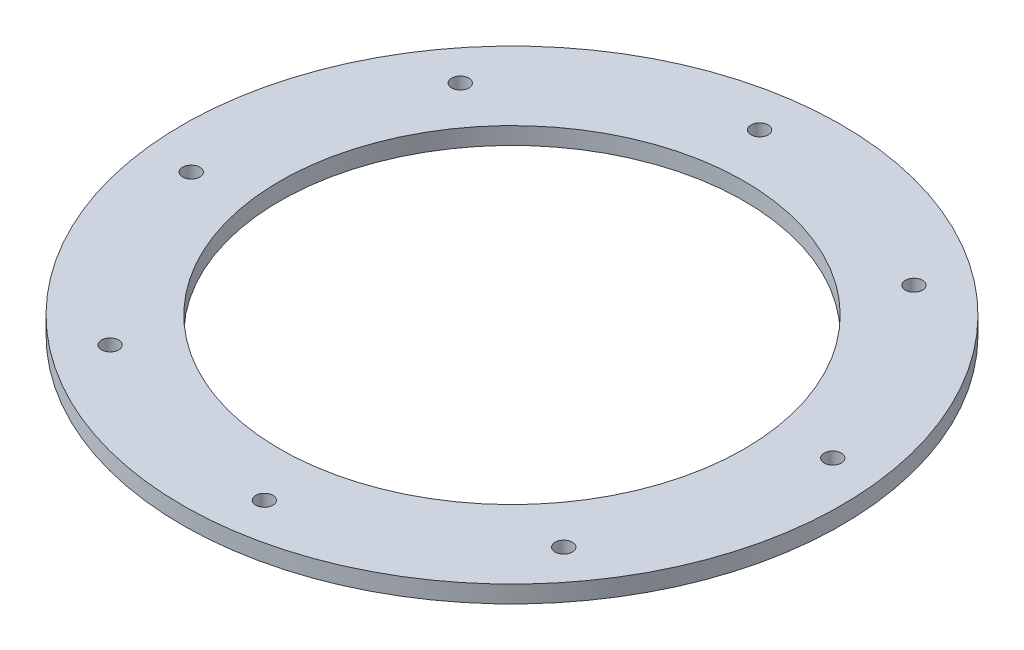
ISO-10303-21;
HEADER;
FILE_DESCRIPTION(('STEP AP214'),'2;1');
FILE_NAME('part.step','',(''),(''),'','','');
FILE_SCHEMA(('AUTOMOTIVE_DESIGN { 1 0 10303 214 1 1 1 1 }'));
ENDSEC;
DATA;
#1=APPLICATION_CONTEXT('core data for automotive mechanical design processes');
#2=APPLICATION_PROTOCOL_DEFINITION('international standard','automotive_design',2000,#1);
#3=PRODUCT_CONTEXT('',#1,'mechanical');
#4=PRODUCT('Part','Part','',(#3));
#5=PRODUCT_RELATED_PRODUCT_CATEGORY('part','',(#4));
#6=PRODUCT_DEFINITION_FORMATION('','',#4);
#7=PRODUCT_DEFINITION_CONTEXT('part definition',#1,'design');
#8=PRODUCT_DEFINITION('design','',#6,#7);
#9=PRODUCT_DEFINITION_SHAPE('','',#8);
#10=(LENGTH_UNIT() NAMED_UNIT(*) SI_UNIT(.MILLI.,.METRE.));
#11=(NAMED_UNIT(*) PLANE_ANGLE_UNIT() SI_UNIT($,.RADIAN.));
#12=(NAMED_UNIT(*) SI_UNIT($,.STERADIAN.) SOLID_ANGLE_UNIT());
#13=UNCERTAINTY_MEASURE_WITH_UNIT(LENGTH_MEASURE(1.E-05),#10,'distance_accuracy_value','');
#14=(GEOMETRIC_REPRESENTATION_CONTEXT(3) GLOBAL_UNCERTAINTY_ASSIGNED_CONTEXT((#13)) GLOBAL_UNIT_ASSIGNED_CONTEXT((#10,
#11,#12)) REPRESENTATION_CONTEXT('',''));
#15=CARTESIAN_POINT('',(0.,0.,0.));
#16=DIRECTION('',(0.,0.,1.));
#17=DIRECTION('',(1.,0.,0.));
#18=AXIS2_PLACEMENT_3D('',#15,#16,#17);
#19=CARTESIAN_POINT('',(0.,-11.,0.));
#20=DIRECTION('',(0.,-1.,0.));
#21=DIRECTION('',(0.791573236897793,0.,0.611074308596877));
#22=AXIS2_PLACEMENT_3D('',#19,#20,#21);
#23=CYLINDRICAL_SURFACE('',#22,40.5);
#24=CARTESIAN_POINT('',(0.,-11.,0.));
#25=DIRECTION('',(0.,1.,0.));
#26=DIRECTION('',(-0.791573236897793,0.,-0.611074308596877));
#27=AXIS2_PLACEMENT_3D('',#24,#25,#26);
#28=CIRCLE('',#27,40.5);
#29=CARTESIAN_POINT('',(-24.7485094981735,-11.,32.0587160943606));
#30=VERTEX_POINT('',#29);
#31=EDGE_CURVE('E11',#30,#30,#28,.T.);
#32=ORIENTED_EDGE('',*,*,#31,.T.);
#33=EDGE_LOOP('',(#32));
#34=FACE_BOUND('',#33,.T.);
#35=CARTESIAN_POINT('',(0.,-14.,0.));
#36=DIRECTION('',(0.,1.,0.));
#37=DIRECTION('',(-0.791573236897793,0.,-0.611074308596877));
#38=AXIS2_PLACEMENT_3D('',#35,#36,#37);
#39=CIRCLE('',#38,40.5);
#40=CARTESIAN_POINT('',(-24.7485094981735,-14.,32.0587160943606));
#41=VERTEX_POINT('',#40);
#42=EDGE_CURVE('E47',#41,#41,#39,.T.);
#43=ORIENTED_EDGE('',*,*,#42,.F.);
#44=EDGE_LOOP('',(#43));
#45=FACE_BOUND('',#44,.T.);
#46=ADVANCED_FACE('F44',(#34,#45),#23,.F.);
#47=CARTESIAN_POINT('',(0.,-11.,0.));
#48=DIRECTION('',(0.,-1.,0.));
#49=DIRECTION('',(0.791573236897793,0.,0.611074308596877));
#50=AXIS2_PLACEMENT_3D('',#47,#48,#49);
#51=CYLINDRICAL_SURFACE('',#50,57.5);
#52=CARTESIAN_POINT('',(0.,-11.,0.));
#53=DIRECTION('',(0.,1.,0.));
#54=DIRECTION('',(-0.611074308596877,0.,0.791573236897793));
#55=AXIS2_PLACEMENT_3D('',#52,#53,#54);
#56=CIRCLE('',#55,57.5);
#57=CARTESIAN_POINT('',(-35.1367727443204,-11.,45.5154611216231));
#58=VERTEX_POINT('',#57);
#59=EDGE_CURVE('E66',#58,#58,#56,.T.);
#60=ORIENTED_EDGE('',*,*,#59,.F.);
#61=EDGE_LOOP('',(#60));
#62=FACE_BOUND('',#61,.T.);
#63=CARTESIAN_POINT('',(0.,-14.,0.));
#64=DIRECTION('',(0.,1.,0.));
#65=DIRECTION('',(-0.611074308596877,0.,0.791573236897793));
#66=AXIS2_PLACEMENT_3D('',#63,#64,#65);
#67=CIRCLE('',#66,57.5);
#68=CARTESIAN_POINT('',(-35.1367727443204,-14.,45.5154611216231));
#69=VERTEX_POINT('',#68);
#70=EDGE_CURVE('E54',#69,#69,#67,.T.);
#71=ORIENTED_EDGE('',*,*,#70,.T.);
#72=EDGE_LOOP('',(#71));
#73=FACE_BOUND('',#72,.T.);
#74=ADVANCED_FACE('F67',(#62,#73),#51,.T.);
#75=CARTESIAN_POINT('',(0.,-11.,0.));
#76=DIRECTION('',(0.,1.,0.));
#77=DIRECTION('',(-0.611074308596877,0.,0.791573236897793));
#78=AXIS2_PLACEMENT_3D('',#75,#76,#77);
#79=PLANE('',#78);
#80=CARTESIAN_POINT('',(39.5786618448896,-11.,30.5537154298439));
#81=DIRECTION('',(0.,1.,0.));
#82=DIRECTION('',(-0.791573236897793,0.,-0.611074308596877));
#83=AXIS2_PLACEMENT_3D('',#80,#81,#82);
#84=CIRCLE('',#83,1.5);
#85=CARTESIAN_POINT('',(38.391301989543,-11.,29.6371039669485));
#86=VERTEX_POINT('',#85);
#87=EDGE_CURVE('E124',#86,#86,#84,.T.);
#88=ORIENTED_EDGE('',*,*,#87,.F.);
#89=EDGE_LOOP('',(#88));
#90=FACE_BOUND('',#89,.T.);
#91=CARTESIAN_POINT('',(6.38160080992409,-11.,49.5910795516974));
#92=DIRECTION('',(0.,1.,0.));
#93=DIRECTION('',(-0.791573236897793,0.,-0.611074308596877));
#94=AXIS2_PLACEMENT_3D('',#91,#92,#93);
#95=CIRCLE('',#94,1.50000000000001);
#96=CARTESIAN_POINT('',(5.1942409545774,-11.,48.674468088802));
#97=VERTEX_POINT('',#96);
#98=EDGE_CURVE('E118',#97,#97,#95,.T.);
#99=ORIENTED_EDGE('',*,*,#98,.F.);
#100=EDGE_LOOP('',(#99));
#101=FACE_BOUND('',#100,.T.);
#102=CARTESIAN_POINT('',(-30.5537154298439,-11.,39.5786618448896));
#103=DIRECTION('',(0.,1.,0.));
#104=DIRECTION('',(-0.791573236897793,0.,-0.611074308596877));
#105=AXIS2_PLACEMENT_3D('',#102,#103,#104);
#106=CIRCLE('',#105,1.5);
#107=CARTESIAN_POINT('',(-31.7410752851905,-11.,38.6620503819943));
#108=VERTEX_POINT('',#107);
#109=EDGE_CURVE('E112',#108,#108,#106,.T.);
#110=ORIENTED_EDGE('',*,*,#109,.F.);
#111=EDGE_LOOP('',(#110));
#112=FACE_BOUND('',#111,.T.);
#113=CARTESIAN_POINT('',(-49.5910795516974,-11.,6.3816008099241));
#114=DIRECTION('',(0.,1.,0.));
#115=DIRECTION('',(-0.791573236897793,0.,-0.611074308596877));
#116=AXIS2_PLACEMENT_3D('',#113,#114,#115);
#117=CIRCLE('',#116,1.5);
#118=CARTESIAN_POINT('',(-50.7784394070441,-11.,5.46498934702878));
#119=VERTEX_POINT('',#118);
#120=EDGE_CURVE('E106',#119,#119,#117,.T.);
#121=ORIENTED_EDGE('',*,*,#120,.F.);
#122=EDGE_LOOP('',(#121));
#123=FACE_BOUND('',#122,.T.);
#124=CARTESIAN_POINT('',(-39.5786618448896,-11.,-30.5537154298438));
#125=DIRECTION('',(0.,1.,0.));
#126=DIRECTION('',(-0.791573236897793,0.,-0.611074308596877));
#127=AXIS2_PLACEMENT_3D('',#124,#125,#126);
#128=CIRCLE('',#127,1.5);
#129=CARTESIAN_POINT('',(-40.7660217002363,-11.,-31.4703268927392));
#130=VERTEX_POINT('',#129);
#131=EDGE_CURVE('E100',#130,#130,#128,.T.);
#132=ORIENTED_EDGE('',*,*,#131,.F.);
#133=EDGE_LOOP('',(#132));
#134=FACE_BOUND('',#133,.T.);
#135=CARTESIAN_POINT('',(-6.3816008099241,-11.,-49.5910795516974));
#136=DIRECTION('',(0.,1.,0.));
#137=DIRECTION('',(-0.791573236897793,0.,-0.611074308596877));
#138=AXIS2_PLACEMENT_3D('',#135,#136,#137);
#139=CIRCLE('',#138,1.5);
#140=CARTESIAN_POINT('',(-7.56896066527079,-11.,-50.5076910145927));
#141=VERTEX_POINT('',#140);
#142=EDGE_CURVE('E94',#141,#141,#139,.T.);
#143=ORIENTED_EDGE('',*,*,#142,.F.);
#144=EDGE_LOOP('',(#143));
#145=FACE_BOUND('',#144,.T.);
#146=CARTESIAN_POINT('',(30.5537154298438,-11.,-39.5786618448896));
#147=DIRECTION('',(0.,1.,0.));
#148=DIRECTION('',(-0.791573236897793,0.,-0.611074308596877));
#149=AXIS2_PLACEMENT_3D('',#146,#147,#148);
#150=CIRCLE('',#149,1.5);
#151=CARTESIAN_POINT('',(29.3663555744972,-11.,-40.495273307785));
#152=VERTEX_POINT('',#151);
#153=EDGE_CURVE('E86',#152,#152,#150,.T.);
#154=ORIENTED_EDGE('',*,*,#153,.F.);
#155=EDGE_LOOP('',(#154));
#156=FACE_BOUND('',#155,.T.);
#157=CARTESIAN_POINT('',(49.5910795516974,-11.,-6.3816008099241));
#158=DIRECTION('',(0.,1.,0.));
#159=DIRECTION('',(-0.791573236897793,0.,-0.611074308596877));
#160=AXIS2_PLACEMENT_3D('',#157,#158,#159);
#161=CIRCLE('',#160,1.5);
#162=CARTESIAN_POINT('',(48.4037196963507,-11.,-7.29821227281942));
#163=VERTEX_POINT('',#162);
#164=EDGE_CURVE('E80',#163,#163,#161,.T.);
#165=ORIENTED_EDGE('',*,*,#164,.F.);
#166=EDGE_LOOP('',(#165));
#167=FACE_BOUND('',#166,.T.);
#168=ORIENTED_EDGE('',*,*,#31,.F.);
#169=EDGE_LOOP('',(#168));
#170=FACE_BOUND('',#169,.T.);
#171=ORIENTED_EDGE('',*,*,#59,.T.);
#172=EDGE_LOOP('',(#171));
#173=FACE_BOUND('',#172,.T.);
#174=ADVANCED_FACE('F140',(#90,#101,#112,#123,#134,#145,#156,#167,#170,#173),#79,.T.);
#175=CARTESIAN_POINT('',(0.,-14.,0.));
#176=DIRECTION('',(0.,1.,0.));
#177=DIRECTION('',(-0.611074308596877,0.,0.791573236897793));
#178=AXIS2_PLACEMENT_3D('',#175,#176,#177);
#179=PLANE('',#178);
#180=CARTESIAN_POINT('',(39.5786618448896,-14.,30.5537154298439));
#181=DIRECTION('',(0.,1.,0.));
#182=DIRECTION('',(-0.791573236897793,0.,-0.611074308596877));
#183=AXIS2_PLACEMENT_3D('',#180,#181,#182);
#184=CIRCLE('',#183,1.5);
#185=CARTESIAN_POINT('',(38.391301989543,-14.,29.6371039669485));
#186=VERTEX_POINT('',#185);
#187=EDGE_CURVE('E78',#186,#186,#184,.T.);
#188=ORIENTED_EDGE('',*,*,#187,.T.);
#189=EDGE_LOOP('',(#188));
#190=FACE_BOUND('',#189,.T.);
#191=CARTESIAN_POINT('',(6.38160080992409,-14.,49.5910795516974));
#192=DIRECTION('',(0.,1.,0.));
#193=DIRECTION('',(-0.791573236897793,0.,-0.611074308596877));
#194=AXIS2_PLACEMENT_3D('',#191,#192,#193);
#195=CIRCLE('',#194,1.50000000000001);
#196=CARTESIAN_POINT('',(5.1942409545774,-14.,48.674468088802));
#197=VERTEX_POINT('',#196);
#198=EDGE_CURVE('E121',#197,#197,#195,.T.);
#199=ORIENTED_EDGE('',*,*,#198,.T.);
#200=EDGE_LOOP('',(#199));
#201=FACE_BOUND('',#200,.T.);
#202=CARTESIAN_POINT('',(-30.5537154298439,-14.,39.5786618448896));
#203=DIRECTION('',(0.,1.,0.));
#204=DIRECTION('',(-0.791573236897793,0.,-0.611074308596877));
#205=AXIS2_PLACEMENT_3D('',#202,#203,#204);
#206=CIRCLE('',#205,1.5);
#207=CARTESIAN_POINT('',(-31.7410752851905,-14.,38.6620503819943));
#208=VERTEX_POINT('',#207);
#209=EDGE_CURVE('E115',#208,#208,#206,.T.);
#210=ORIENTED_EDGE('',*,*,#209,.T.);
#211=EDGE_LOOP('',(#210));
#212=FACE_BOUND('',#211,.T.);
#213=CARTESIAN_POINT('',(-49.5910795516974,-14.,6.3816008099241));
#214=DIRECTION('',(0.,1.,0.));
#215=DIRECTION('',(-0.791573236897793,0.,-0.611074308596877));
#216=AXIS2_PLACEMENT_3D('',#213,#214,#215);
#217=CIRCLE('',#216,1.5);
#218=CARTESIAN_POINT('',(-50.7784394070441,-14.,5.46498934702878));
#219=VERTEX_POINT('',#218);
#220=EDGE_CURVE('E109',#219,#219,#217,.T.);
#221=ORIENTED_EDGE('',*,*,#220,.T.);
#222=EDGE_LOOP('',(#221));
#223=FACE_BOUND('',#222,.T.);
#224=CARTESIAN_POINT('',(-39.5786618448896,-14.,-30.5537154298438));
#225=DIRECTION('',(0.,1.,0.));
#226=DIRECTION('',(-0.791573236897793,0.,-0.611074308596877));
#227=AXIS2_PLACEMENT_3D('',#224,#225,#226);
#228=CIRCLE('',#227,1.5);
#229=CARTESIAN_POINT('',(-40.7660217002363,-14.,-31.4703268927392));
#230=VERTEX_POINT('',#229);
#231=EDGE_CURVE('E103',#230,#230,#228,.T.);
#232=ORIENTED_EDGE('',*,*,#231,.T.);
#233=EDGE_LOOP('',(#232));
#234=FACE_BOUND('',#233,.T.);
#235=CARTESIAN_POINT('',(-6.3816008099241,-14.,-49.5910795516974));
#236=DIRECTION('',(0.,1.,0.));
#237=DIRECTION('',(-0.791573236897793,0.,-0.611074308596877));
#238=AXIS2_PLACEMENT_3D('',#235,#236,#237);
#239=CIRCLE('',#238,1.5);
#240=CARTESIAN_POINT('',(-7.56896066527079,-14.,-50.5076910145927));
#241=VERTEX_POINT('',#240);
#242=EDGE_CURVE('E97',#241,#241,#239,.T.);
#243=ORIENTED_EDGE('',*,*,#242,.T.);
#244=EDGE_LOOP('',(#243));
#245=FACE_BOUND('',#244,.T.);
#246=CARTESIAN_POINT('',(30.5537154298438,-14.,-39.5786618448896));
#247=DIRECTION('',(0.,1.,0.));
#248=DIRECTION('',(-0.791573236897793,0.,-0.611074308596877));
#249=AXIS2_PLACEMENT_3D('',#246,#247,#248);
#250=CIRCLE('',#249,1.5);
#251=CARTESIAN_POINT('',(29.3663555744972,-14.,-40.495273307785));
#252=VERTEX_POINT('',#251);
#253=EDGE_CURVE('E90',#252,#252,#250,.T.);
#254=ORIENTED_EDGE('',*,*,#253,.T.);
#255=EDGE_LOOP('',(#254));
#256=FACE_BOUND('',#255,.T.);
#257=CARTESIAN_POINT('',(49.5910795516974,-14.,-6.3816008099241));
#258=DIRECTION('',(0.,1.,0.));
#259=DIRECTION('',(-0.791573236897793,0.,-0.611074308596877));
#260=AXIS2_PLACEMENT_3D('',#257,#258,#259);
#261=CIRCLE('',#260,1.5);
#262=CARTESIAN_POINT('',(48.4037196963507,-14.,-7.29821227281942));
#263=VERTEX_POINT('',#262);
#264=EDGE_CURVE('E83',#263,#263,#261,.T.);
#265=ORIENTED_EDGE('',*,*,#264,.T.);
#266=EDGE_LOOP('',(#265));
#267=FACE_BOUND('',#266,.T.);
#268=ORIENTED_EDGE('',*,*,#42,.T.);
#269=EDGE_LOOP('',(#268));
#270=FACE_BOUND('',#269,.T.);
#271=ORIENTED_EDGE('',*,*,#70,.F.);
#272=EDGE_LOOP('',(#271));
#273=FACE_BOUND('',#272,.T.);
#274=ADVANCED_FACE('F130',(#190,#201,#212,#223,#234,#245,#256,#267,#270,#273),#179,.F.);
#275=CARTESIAN_POINT('',(49.5910795516974,-14.,-6.3816008099241));
#276=DIRECTION('',(0.,1.,0.));
#277=DIRECTION('',(-0.791573236897793,0.,-0.611074308596877));
#278=AXIS2_PLACEMENT_3D('',#275,#276,#277);
#279=CYLINDRICAL_SURFACE('',#278,1.5);
#280=ORIENTED_EDGE('',*,*,#264,.F.);
#281=EDGE_LOOP('',(#280));
#282=FACE_BOUND('',#281,.T.);
#283=ORIENTED_EDGE('',*,*,#164,.T.);
#284=EDGE_LOOP('',(#283));
#285=FACE_BOUND('',#284,.T.);
#286=ADVANCED_FACE('F158',(#282,#285),#279,.F.);
#287=CARTESIAN_POINT('',(30.5537154298438,-14.,-39.5786618448896));
#288=DIRECTION('',(0.,1.,0.));
#289=DIRECTION('',(-0.791573236897793,0.,-0.611074308596877));
#290=AXIS2_PLACEMENT_3D('',#287,#288,#289);
#291=CYLINDRICAL_SURFACE('',#290,1.5);
#292=ORIENTED_EDGE('',*,*,#253,.F.);
#293=EDGE_LOOP('',(#292));
#294=FACE_BOUND('',#293,.T.);
#295=ORIENTED_EDGE('',*,*,#153,.T.);
#296=EDGE_LOOP('',(#295));
#297=FACE_BOUND('',#296,.T.);
#298=ADVANCED_FACE('F160',(#294,#297),#291,.F.);
#299=CARTESIAN_POINT('',(-6.3816008099241,-14.,-49.5910795516974));
#300=DIRECTION('',(0.,1.,0.));
#301=DIRECTION('',(-0.791573236897793,0.,-0.611074308596877));
#302=AXIS2_PLACEMENT_3D('',#299,#300,#301);
#303=CYLINDRICAL_SURFACE('',#302,1.5);
#304=ORIENTED_EDGE('',*,*,#242,.F.);
#305=EDGE_LOOP('',(#304));
#306=FACE_BOUND('',#305,.T.);
#307=ORIENTED_EDGE('',*,*,#142,.T.);
#308=EDGE_LOOP('',(#307));
#309=FACE_BOUND('',#308,.T.);
#310=ADVANCED_FACE('F167',(#306,#309),#303,.F.);
#311=CARTESIAN_POINT('',(-39.5786618448896,-14.,-30.5537154298438));
#312=DIRECTION('',(0.,1.,0.));
#313=DIRECTION('',(-0.791573236897793,0.,-0.611074308596877));
#314=AXIS2_PLACEMENT_3D('',#311,#312,#313);
#315=CYLINDRICAL_SURFACE('',#314,1.5);
#316=ORIENTED_EDGE('',*,*,#231,.F.);
#317=EDGE_LOOP('',(#316));
#318=FACE_BOUND('',#317,.T.);
#319=ORIENTED_EDGE('',*,*,#131,.T.);
#320=EDGE_LOOP('',(#319));
#321=FACE_BOUND('',#320,.T.);
#322=ADVANCED_FACE('F206',(#318,#321),#315,.F.);
#323=CARTESIAN_POINT('',(-49.5910795516974,-14.,6.3816008099241));
#324=DIRECTION('',(0.,1.,0.));
#325=DIRECTION('',(-0.791573236897793,0.,-0.611074308596877));
#326=AXIS2_PLACEMENT_3D('',#323,#324,#325);
#327=CYLINDRICAL_SURFACE('',#326,1.5);
#328=ORIENTED_EDGE('',*,*,#220,.F.);
#329=EDGE_LOOP('',(#328));
#330=FACE_BOUND('',#329,.T.);
#331=ORIENTED_EDGE('',*,*,#120,.T.);
#332=EDGE_LOOP('',(#331));
#333=FACE_BOUND('',#332,.T.);
#334=ADVANCED_FACE('F216',(#330,#333),#327,.F.);
#335=CARTESIAN_POINT('',(-30.5537154298439,-14.,39.5786618448896));
#336=DIRECTION('',(0.,1.,0.));
#337=DIRECTION('',(-0.791573236897793,0.,-0.611074308596877));
#338=AXIS2_PLACEMENT_3D('',#335,#336,#337);
#339=CYLINDRICAL_SURFACE('',#338,1.5);
#340=ORIENTED_EDGE('',*,*,#209,.F.);
#341=EDGE_LOOP('',(#340));
#342=FACE_BOUND('',#341,.T.);
#343=ORIENTED_EDGE('',*,*,#109,.T.);
#344=EDGE_LOOP('',(#343));
#345=FACE_BOUND('',#344,.T.);
#346=ADVANCED_FACE('F226',(#342,#345),#339,.F.);
#347=CARTESIAN_POINT('',(6.38160080992409,-14.,49.5910795516974));
#348=DIRECTION('',(0.,1.,0.));
#349=DIRECTION('',(-0.791573236897793,0.,-0.611074308596877));
#350=AXIS2_PLACEMENT_3D('',#347,#348,#349);
#351=CYLINDRICAL_SURFACE('',#350,1.50000000000001);
#352=ORIENTED_EDGE('',*,*,#198,.F.);
#353=EDGE_LOOP('',(#352));
#354=FACE_BOUND('',#353,.T.);
#355=ORIENTED_EDGE('',*,*,#98,.T.);
#356=EDGE_LOOP('',(#355));
#357=FACE_BOUND('',#356,.T.);
#358=ADVANCED_FACE('F136',(#354,#357),#351,.F.);
#359=CARTESIAN_POINT('',(39.5786618448896,-14.,30.5537154298439));
#360=DIRECTION('',(0.,1.,0.));
#361=DIRECTION('',(-0.791573236897793,0.,-0.611074308596877));
#362=AXIS2_PLACEMENT_3D('',#359,#360,#361);
#363=CYLINDRICAL_SURFACE('',#362,1.5);
#364=ORIENTED_EDGE('',*,*,#187,.F.);
#365=EDGE_LOOP('',(#364));
#366=FACE_BOUND('',#365,.T.);
#367=ORIENTED_EDGE('',*,*,#87,.T.);
#368=EDGE_LOOP('',(#367));
#369=FACE_BOUND('',#368,.T.);
#370=ADVANCED_FACE('F133',(#366,#369),#363,.F.);
#371=CLOSED_SHELL('',(#46,#74,#174,#274,#286,#298,#310,#322,#334,#346,#358,#370));
#372=MANIFOLD_SOLID_BREP('B2',#371);
#373=ADVANCED_BREP_SHAPE_REPRESENTATION('',(#18,#372),#14);
#374=SHAPE_DEFINITION_REPRESENTATION(#9,#373);
ENDSEC;
END-ISO-10303-21;
